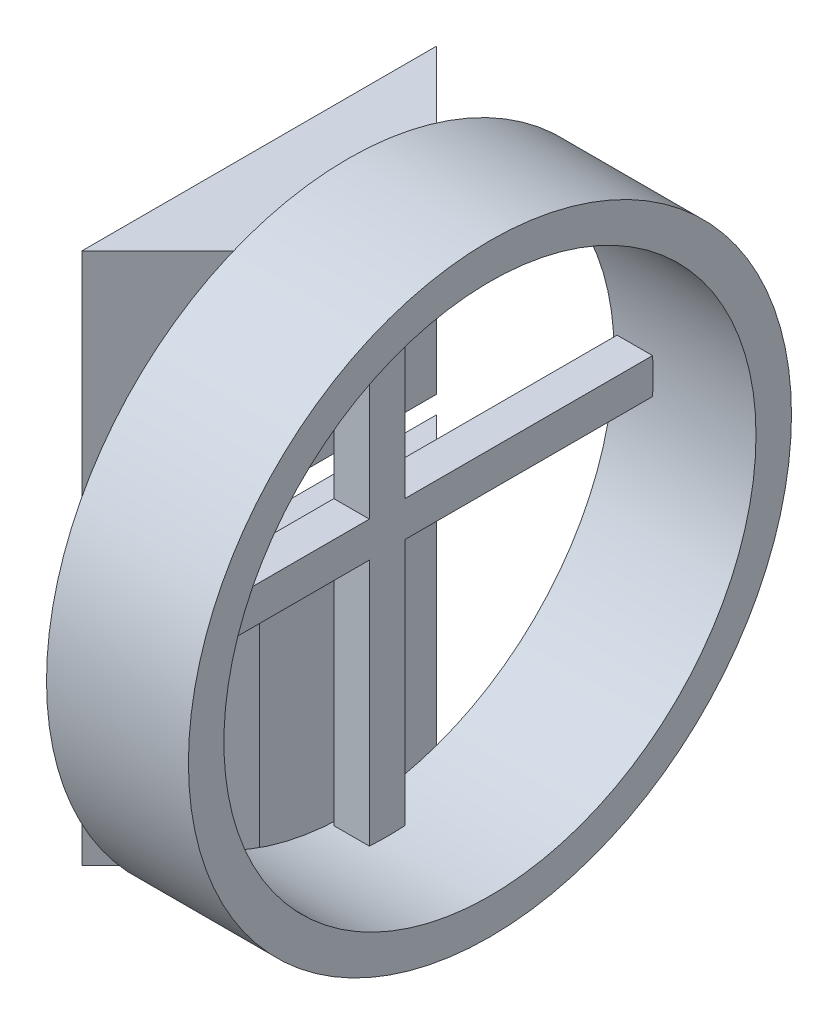
ISO-10303-21;
HEADER;
FILE_DESCRIPTION(('STEP AP214'),'2;1');
FILE_NAME('part.step','',(''),(''),'','','');
FILE_SCHEMA(('AUTOMOTIVE_DESIGN { 1 0 10303 214 1 1 1 1 }'));
ENDSEC;
DATA;
#1=APPLICATION_CONTEXT('core data for automotive mechanical design processes');
#2=APPLICATION_PROTOCOL_DEFINITION('international standard','automotive_design',2000,#1);
#3=PRODUCT_CONTEXT('',#1,'mechanical');
#4=PRODUCT('Part','Part','',(#3));
#5=PRODUCT_RELATED_PRODUCT_CATEGORY('part','',(#4));
#6=PRODUCT_DEFINITION_FORMATION('','',#4);
#7=PRODUCT_DEFINITION_CONTEXT('part definition',#1,'design');
#8=PRODUCT_DEFINITION('design','',#6,#7);
#9=PRODUCT_DEFINITION_SHAPE('','',#8);
#10=(LENGTH_UNIT() NAMED_UNIT(*) SI_UNIT(.MILLI.,.METRE.));
#11=(NAMED_UNIT(*) PLANE_ANGLE_UNIT() SI_UNIT($,.RADIAN.));
#12=(NAMED_UNIT(*) SI_UNIT($,.STERADIAN.) SOLID_ANGLE_UNIT());
#13=UNCERTAINTY_MEASURE_WITH_UNIT(LENGTH_MEASURE(1.E-05),#10,'distance_accuracy_value','');
#14=(GEOMETRIC_REPRESENTATION_CONTEXT(3) GLOBAL_UNCERTAINTY_ASSIGNED_CONTEXT((#13)) GLOBAL_UNIT_ASSIGNED_CONTEXT((#10,
#11,#12)) REPRESENTATION_CONTEXT('',''));
#15=CARTESIAN_POINT('',(0.,0.,0.));
#16=DIRECTION('',(0.,0.,1.));
#17=DIRECTION('',(1.,0.,0.));
#18=AXIS2_PLACEMENT_3D('',#15,#16,#17);
#19=CARTESIAN_POINT('',(10.,15.,0.));
#20=DIRECTION('',(1.,0.,0.));
#21=DIRECTION('',(0.,0.,-1.));
#22=AXIS2_PLACEMENT_3D('',#19,#20,#21);
#23=PLANE('',#22);
#24=DIRECTION('',(0.,-1.,0.));
#25=VECTOR('',#24,1.);
#26=CARTESIAN_POINT('',(10.,15.,5.));
#27=LINE('',#26,#25);
#28=CARTESIAN_POINT('',(10.,6.,5.));
#29=VERTEX_POINT('',#28);
#30=CARTESIAN_POINT('',(10.,0.,5.));
#31=VERTEX_POINT('',#30);
#32=EDGE_CURVE('E111',#29,#31,#27,.T.);
#33=ORIENTED_EDGE('',*,*,#32,.F.);
#34=DIRECTION('',(0.,0.,-1.));
#35=VECTOR('',#34,1.);
#36=CARTESIAN_POINT('',(10.,6.,0.));
#37=LINE('',#36,#35);
#38=CARTESIAN_POINT('',(10.,6.,-5.00000000000002));
#39=VERTEX_POINT('',#38);
#40=EDGE_CURVE('E74',#29,#39,#37,.T.);
#41=ORIENTED_EDGE('',*,*,#40,.T.);
#42=DIRECTION('',(0.,-1.,0.));
#43=VECTOR('',#42,1.);
#44=CARTESIAN_POINT('',(10.,15.,-5.00000000000002));
#45=LINE('',#44,#43);
#46=CARTESIAN_POINT('',(10.,0.,-5.00000000000002));
#47=VERTEX_POINT('',#46);
#48=EDGE_CURVE('E55',#39,#47,#45,.T.);
#49=ORIENTED_EDGE('',*,*,#48,.T.);
#50=DIRECTION('',(0.,0.,1.));
#51=VECTOR('',#50,1.);
#52=CARTESIAN_POINT('',(10.,0.,0.));
#53=LINE('',#52,#51);
#54=EDGE_CURVE('E115',#47,#31,#53,.T.);
#55=ORIENTED_EDGE('',*,*,#54,.T.);
#56=EDGE_LOOP('',(#33,#41,#49,#55));
#57=FACE_BOUND('',#56,.T.);
#58=ADVANCED_FACE('F52',(#57),#23,.F.);
#59=CARTESIAN_POINT('',(7.50000000000001,15.,7.5));
#60=DIRECTION('',(-0.707106781186548,0.,-0.707106781186547));
#61=DIRECTION('',(-0.707106781186547,0.,0.707106781186548));
#62=AXIS2_PLACEMENT_3D('',#59,#60,#61);
#63=PLANE('',#62);
#64=DIRECTION('',(0.,-1.,0.));
#65=VECTOR('',#64,1.);
#66=CARTESIAN_POINT('',(12.5,15.,2.5));
#67=LINE('',#66,#65);
#68=CARTESIAN_POINT('',(12.5,6.,2.5));
#69=VERTEX_POINT('',#68);
#70=CARTESIAN_POINT('',(12.5,0.,2.5));
#71=VERTEX_POINT('',#70);
#72=EDGE_CURVE('E96',#69,#71,#67,.T.);
#73=ORIENTED_EDGE('',*,*,#72,.F.);
#74=DIRECTION('',(-0.707106781186547,0.,0.707106781186548));
#75=VECTOR('',#74,1.);
#76=CARTESIAN_POINT('',(7.50000000000001,6.,7.5));
#77=LINE('',#76,#75);
#78=EDGE_CURVE('E68',#69,#29,#77,.T.);
#79=ORIENTED_EDGE('',*,*,#78,.T.);
#80=ORIENTED_EDGE('',*,*,#32,.T.);
#81=DIRECTION('',(0.707106781186547,0.,-0.707106781186548));
#82=VECTOR('',#81,1.);
#83=CARTESIAN_POINT('',(7.50000000000001,0.,7.5));
#84=LINE('',#83,#82);
#85=EDGE_CURVE('E97',#31,#71,#84,.T.);
#86=ORIENTED_EDGE('',*,*,#85,.T.);
#87=EDGE_LOOP('',(#73,#79,#80,#86));
#88=FACE_BOUND('',#87,.T.);
#89=ADVANCED_FACE('F121',(#88),#63,.F.);
#90=CARTESIAN_POINT('',(12.5,15.,0.));
#91=DIRECTION('',(1.,0.,0.));
#92=DIRECTION('',(0.,0.,-1.));
#93=AXIS2_PLACEMENT_3D('',#90,#91,#92);
#94=PLANE('',#93);
#95=DIRECTION('',(0.,0.,1.));
#96=VECTOR('',#95,1.);
#97=CARTESIAN_POINT('',(12.5,6.,-8.5));
#98=LINE('',#97,#96);
#99=CARTESIAN_POINT('',(12.5,6.,-2.5));
#100=VERTEX_POINT('',#99);
#101=EDGE_CURVE('E89',#100,#69,#98,.T.);
#102=ORIENTED_EDGE('',*,*,#101,.T.);
#103=ORIENTED_EDGE('',*,*,#72,.T.);
#104=DIRECTION('',(0.,0.,1.));
#105=VECTOR('',#104,1.);
#106=CARTESIAN_POINT('',(12.5,0.,0.));
#107=LINE('',#106,#105);
#108=CARTESIAN_POINT('',(12.5,0.,-2.5));
#109=VERTEX_POINT('',#108);
#110=EDGE_CURVE('E13',#109,#71,#107,.T.);
#111=ORIENTED_EDGE('',*,*,#110,.F.);
#112=DIRECTION('',(0.,-1.,0.));
#113=VECTOR('',#112,1.);
#114=CARTESIAN_POINT('',(12.5,15.,-2.5));
#115=LINE('',#114,#113);
#116=EDGE_CURVE('E103',#100,#109,#115,.T.);
#117=ORIENTED_EDGE('',*,*,#116,.F.);
#118=EDGE_LOOP('',(#102,#103,#111,#117));
#119=FACE_BOUND('',#118,.T.);
#120=ADVANCED_FACE('F107',(#119),#94,.T.);
#121=CARTESIAN_POINT('',(7.50000000000007,15.,-7.49999999999999));
#122=DIRECTION('',(-0.707106781186551,0.,0.707106781186544));
#123=DIRECTION('',(0.707106781186544,0.,0.707106781186551));
#124=AXIS2_PLACEMENT_3D('',#121,#122,#123);
#125=PLANE('',#124);
#126=ORIENTED_EDGE('',*,*,#48,.F.);
#127=DIRECTION('',(0.707106781186544,0.,0.707106781186551));
#128=VECTOR('',#127,1.);
#129=CARTESIAN_POINT('',(7.50000000000007,6.,-7.49999999999999));
#130=LINE('',#129,#128);
#131=EDGE_CURVE('E92',#39,#100,#130,.T.);
#132=ORIENTED_EDGE('',*,*,#131,.T.);
#133=ORIENTED_EDGE('',*,*,#116,.T.);
#134=DIRECTION('',(-0.707106781186544,0.,-0.707106781186551));
#135=VECTOR('',#134,1.);
#136=CARTESIAN_POINT('',(7.50000000000007,0.,-7.49999999999999));
#137=LINE('',#136,#135);
#138=EDGE_CURVE('E60',#109,#47,#137,.T.);
#139=ORIENTED_EDGE('',*,*,#138,.T.);
#140=EDGE_LOOP('',(#126,#132,#133,#139));
#141=FACE_BOUND('',#140,.T.);
#142=ADVANCED_FACE('F101',(#141),#125,.F.);
#143=CARTESIAN_POINT('',(0.,0.,0.));
#144=DIRECTION('',(0.,1.,0.));
#145=DIRECTION('',(0.,0.,1.));
#146=AXIS2_PLACEMENT_3D('',#143,#144,#145);
#147=PLANE('',#146);
#148=ORIENTED_EDGE('',*,*,#54,.F.);
#149=ORIENTED_EDGE('',*,*,#138,.F.);
#150=ORIENTED_EDGE('',*,*,#110,.T.);
#151=ORIENTED_EDGE('',*,*,#85,.F.);
#152=EDGE_LOOP('',(#148,#149,#150,#151));
#153=FACE_BOUND('',#152,.T.);
#154=ADVANCED_FACE('F125',(#153),#147,.F.);
#155=CARTESIAN_POINT('',(7.50000000000002,6.,-8.5));
#156=DIRECTION('',(0.,-1.,0.));
#157=DIRECTION('',(0.,0.,-1.));
#158=AXIS2_PLACEMENT_3D('',#155,#156,#157);
#159=PLANE('',#158);
#160=ORIENTED_EDGE('',*,*,#101,.F.);
#161=ORIENTED_EDGE('',*,*,#131,.F.);
#162=ORIENTED_EDGE('',*,*,#40,.F.);
#163=ORIENTED_EDGE('',*,*,#78,.F.);
#164=EDGE_LOOP('',(#160,#161,#162,#163));
#165=FACE_BOUND('',#164,.T.);
#166=ADVANCED_FACE('F91',(#165),#159,.F.);
#167=CLOSED_SHELL('',(#58,#89,#120,#142,#154,#166));
#168=MANIFOLD_SOLID_BREP('B2',#167);
#169=CARTESIAN_POINT('',(13.6,7.,0.));
#170=DIRECTION('',(0.,-1.,0.));
#171=DIRECTION('',(0.,0.,-1.));
#172=AXIS2_PLACEMENT_3D('',#169,#170,#171);
#173=PLANE('',#172);
#174=DIRECTION('',(0.,0.,-1.));
#175=VECTOR('',#174,1.);
#176=CARTESIAN_POINT('',(12.6,7.,0.));
#177=LINE('',#176,#175);
#178=CARTESIAN_POINT('',(12.6,7.,0.499999999999986));
#179=VERTEX_POINT('',#178);
#180=CARTESIAN_POINT('',(12.6,7.,7.48331477354788));
#181=VERTEX_POINT('',#180);
#182=EDGE_CURVE('E313',#179,#181,#177,.F.);
#183=ORIENTED_EDGE('',*,*,#182,.F.);
#184=DIRECTION('',(1.,0.,0.));
#185=VECTOR('',#184,1.);
#186=CARTESIAN_POINT('',(13.6,7.,0.499999999999995));
#187=LINE('',#186,#185);
#188=CARTESIAN_POINT('',(13.6,7.,0.499999999999999));
#189=VERTEX_POINT('',#188);
#190=EDGE_CURVE('E353',#179,#189,#187,.T.);
#191=ORIENTED_EDGE('',*,*,#190,.T.);
#192=DIRECTION('',(0.,0.,-1.));
#193=VECTOR('',#192,1.);
#194=CARTESIAN_POINT('',(13.6,7.,0.));
#195=LINE('',#194,#193);
#196=CARTESIAN_POINT('',(13.6,7.,7.48331477354788));
#197=VERTEX_POINT('',#196);
#198=EDGE_CURVE('E301',#189,#197,#195,.F.);
#199=ORIENTED_EDGE('',*,*,#198,.T.);
#200=DIRECTION('',(-1.,0.,0.));
#201=VECTOR('',#200,1.);
#202=CARTESIAN_POINT('',(16.5,7.,7.48331477354788));
#203=LINE('',#202,#201);
#204=EDGE_CURVE('E189',#197,#181,#203,.T.);
#205=ORIENTED_EDGE('',*,*,#204,.T.);
#206=EDGE_LOOP('',(#183,#191,#199,#205));
#207=FACE_BOUND('',#206,.T.);
#208=ADVANCED_FACE('F185',(#207),#173,.T.);
#209=CARTESIAN_POINT('',(13.6,8.,0.));
#210=DIRECTION('',(0.,-1.,0.));
#211=DIRECTION('',(0.,0.,-1.));
#212=AXIS2_PLACEMENT_3D('',#209,#210,#211);
#213=PLANE('',#212);
#214=DIRECTION('',(1.,0.,0.));
#215=VECTOR('',#214,1.);
#216=CARTESIAN_POINT('',(13.6,8.,0.500000000000006));
#217=LINE('',#216,#215);
#218=CARTESIAN_POINT('',(12.6,8.,0.500000000000002));
#219=VERTEX_POINT('',#218);
#220=CARTESIAN_POINT('',(13.6,8.,0.500000000000015));
#221=VERTEX_POINT('',#220);
#222=EDGE_CURVE('E359',#219,#221,#217,.T.);
#223=ORIENTED_EDGE('',*,*,#222,.F.);
#224=DIRECTION('',(0.,0.,-1.));
#225=VECTOR('',#224,1.);
#226=CARTESIAN_POINT('',(12.6,8.,0.));
#227=LINE('',#226,#225);
#228=CARTESIAN_POINT('',(12.6,8.,7.48331477354788));
#229=VERTEX_POINT('',#228);
#230=EDGE_CURVE('E312',#219,#229,#227,.F.);
#231=ORIENTED_EDGE('',*,*,#230,.T.);
#232=DIRECTION('',(-1.,0.,0.));
#233=VECTOR('',#232,1.);
#234=CARTESIAN_POINT('',(16.5,8.,7.48331477354788));
#235=LINE('',#234,#233);
#236=CARTESIAN_POINT('',(13.6,8.,7.48331477354788));
#237=VERTEX_POINT('',#236);
#238=EDGE_CURVE('E332',#237,#229,#235,.T.);
#239=ORIENTED_EDGE('',*,*,#238,.F.);
#240=DIRECTION('',(0.,0.,-1.));
#241=VECTOR('',#240,1.);
#242=CARTESIAN_POINT('',(13.6,8.,0.));
#243=LINE('',#242,#241);
#244=EDGE_CURVE('E316',#221,#237,#243,.F.);
#245=ORIENTED_EDGE('',*,*,#244,.F.);
#246=EDGE_LOOP('',(#223,#231,#239,#245));
#247=FACE_BOUND('',#246,.T.);
#248=ADVANCED_FACE('F358',(#247),#213,.F.);
#249=CARTESIAN_POINT('',(16.5,7.5,0.));
#250=DIRECTION('',(1.,0.,0.));
#251=DIRECTION('',(0.,0.,-1.));
#252=AXIS2_PLACEMENT_3D('',#249,#250,#251);
#253=PLANE('',#252);
#254=CARTESIAN_POINT('',(16.5,7.5,0.));
#255=DIRECTION('',(1.,0.,0.));
#256=DIRECTION('',(0.,0.,-1.));
#257=AXIS2_PLACEMENT_3D('',#254,#255,#256);
#258=CIRCLE('',#257,8.5);
#259=CARTESIAN_POINT('',(16.5,7.5,-8.5));
#260=VERTEX_POINT('',#259);
#261=EDGE_CURVE('E320',#260,#260,#258,.T.);
#262=ORIENTED_EDGE('',*,*,#261,.T.);
#263=EDGE_LOOP('',(#262));
#264=FACE_BOUND('',#263,.T.);
#265=CARTESIAN_POINT('',(16.5,7.5,0.));
#266=DIRECTION('',(1.,0.,0.));
#267=DIRECTION('',(0.,0.,-1.));
#268=AXIS2_PLACEMENT_3D('',#265,#266,#267);
#269=CIRCLE('',#268,7.5);
#270=CARTESIAN_POINT('',(16.5,7.5,-7.5));
#271=VERTEX_POINT('',#270);
#272=EDGE_CURVE('E304',#271,#271,#269,.T.);
#273=ORIENTED_EDGE('',*,*,#272,.F.);
#274=EDGE_LOOP('',(#273));
#275=FACE_BOUND('',#274,.T.);
#276=ADVANCED_FACE('F416',(#264,#275),#253,.T.);
#277=CARTESIAN_POINT('',(12.5,7.5,0.));
#278=DIRECTION('',(1.,0.,0.));
#279=DIRECTION('',(0.,0.,-1.));
#280=AXIS2_PLACEMENT_3D('',#277,#278,#279);
#281=PLANE('',#280);
#282=CARTESIAN_POINT('',(12.5,7.5,0.));
#283=DIRECTION('',(1.,0.,0.));
#284=DIRECTION('',(0.,0.,-1.));
#285=AXIS2_PLACEMENT_3D('',#282,#283,#284);
#286=CIRCLE('',#285,7.5);
#287=CARTESIAN_POINT('',(12.5,7.5,-7.5));
#288=VERTEX_POINT('',#287);
#289=EDGE_CURVE('E300',#288,#288,#286,.T.);
#290=ORIENTED_EDGE('',*,*,#289,.T.);
#291=EDGE_LOOP('',(#290));
#292=FACE_BOUND('',#291,.T.);
#293=CARTESIAN_POINT('',(12.5,7.5,0.));
#294=DIRECTION('',(1.,0.,0.));
#295=DIRECTION('',(0.,0.,-1.));
#296=AXIS2_PLACEMENT_3D('',#293,#294,#295);
#297=CIRCLE('',#296,8.5);
#298=CARTESIAN_POINT('',(12.5,7.5,-8.5));
#299=VERTEX_POINT('',#298);
#300=EDGE_CURVE('E318',#299,#299,#297,.T.);
#301=ORIENTED_EDGE('',*,*,#300,.F.);
#302=EDGE_LOOP('',(#301));
#303=FACE_BOUND('',#302,.T.);
#304=ADVANCED_FACE('F408',(#292,#303),#281,.F.);
#305=CARTESIAN_POINT('',(16.5,7.5,0.));
#306=DIRECTION('',(-1.,0.,0.));
#307=DIRECTION('',(0.,0.,1.));
#308=AXIS2_PLACEMENT_3D('',#305,#306,#307);
#309=CYLINDRICAL_SURFACE('',#308,8.5);
#310=ORIENTED_EDGE('',*,*,#261,.F.);
#311=EDGE_LOOP('',(#310));
#312=FACE_BOUND('',#311,.T.);
#313=ORIENTED_EDGE('',*,*,#300,.T.);
#314=EDGE_LOOP('',(#313));
#315=FACE_BOUND('',#314,.T.);
#316=ADVANCED_FACE('F187',(#312,#315),#309,.T.);
#317=CARTESIAN_POINT('',(16.5,7.5,0.));
#318=DIRECTION('',(-1.,0.,0.));
#319=DIRECTION('',(0.,0.,1.));
#320=AXIS2_PLACEMENT_3D('',#317,#318,#319);
#321=CYLINDRICAL_SURFACE('',#320,7.5);
#322=CARTESIAN_POINT('',(13.6,7.5,0.));
#323=DIRECTION('',(1.,0.,0.));
#324=DIRECTION('',(0.,0.,-1.));
#325=AXIS2_PLACEMENT_3D('',#322,#323,#324);
#326=CIRCLE('',#325,7.5);
#327=CARTESIAN_POINT('',(13.6,14.9833147735479,-0.499999999999974));
#328=VERTEX_POINT('',#327);
#329=CARTESIAN_POINT('',(13.6,14.9833147735479,0.500000000000027));
#330=VERTEX_POINT('',#329);
#331=EDGE_CURVE('E375',#328,#330,#326,.T.);
#332=ORIENTED_EDGE('',*,*,#331,.F.);
#333=DIRECTION('',(-1.,0.,0.));
#334=VECTOR('',#333,1.);
#335=CARTESIAN_POINT('',(16.5,14.9833147735479,-0.499999999999974));
#336=LINE('',#335,#334);
#337=CARTESIAN_POINT('',(12.6,14.9833147735479,-0.499999999999974));
#338=VERTEX_POINT('',#337);
#339=EDGE_CURVE('E378',#338,#328,#336,.F.);
#340=ORIENTED_EDGE('',*,*,#339,.F.);
#341=CARTESIAN_POINT('',(12.6,7.5,0.));
#342=DIRECTION('',(1.,0.,0.));
#343=DIRECTION('',(0.,0.,-1.));
#344=AXIS2_PLACEMENT_3D('',#341,#342,#343);
#345=CIRCLE('',#344,7.5);
#346=CARTESIAN_POINT('',(12.6,14.9833147735479,0.500000000000027));
#347=VERTEX_POINT('',#346);
#348=EDGE_CURVE('E372',#338,#347,#345,.T.);
#349=ORIENTED_EDGE('',*,*,#348,.T.);
#350=DIRECTION('',(-1.,0.,0.));
#351=VECTOR('',#350,1.);
#352=CARTESIAN_POINT('',(16.5,14.9833147735479,0.500000000000027));
#353=LINE('',#352,#351);
#354=EDGE_CURVE('E364',#347,#330,#353,.F.);
#355=ORIENTED_EDGE('',*,*,#354,.T.);
#356=EDGE_LOOP('',(#332,#340,#349,#355));
#357=FACE_BOUND('',#356,.T.);
#358=CARTESIAN_POINT('',(13.6,0.0166852264521155,0.499999999999974));
#359=VERTEX_POINT('',#358);
#360=CARTESIAN_POINT('',(13.6,0.016685226452119,-0.500000000000027));
#361=VERTEX_POINT('',#360);
#362=EDGE_CURVE('E293',#359,#361,#326,.T.);
#363=ORIENTED_EDGE('',*,*,#362,.F.);
#364=DIRECTION('',(-1.,0.,0.));
#365=VECTOR('',#364,1.);
#366=CARTESIAN_POINT('',(16.5,0.0166852264521155,0.499999999999974));
#367=LINE('',#366,#365);
#368=CARTESIAN_POINT('',(12.6,0.0166852264521155,0.499999999999974));
#369=VERTEX_POINT('',#368);
#370=EDGE_CURVE('E380',#359,#369,#367,.T.);
#371=ORIENTED_EDGE('',*,*,#370,.T.);
#372=CARTESIAN_POINT('',(12.6,0.016685226452119,-0.500000000000027));
#373=VERTEX_POINT('',#372);
#374=EDGE_CURVE('E374',#369,#373,#345,.T.);
#375=ORIENTED_EDGE('',*,*,#374,.T.);
#376=DIRECTION('',(-1.,0.,0.));
#377=VECTOR('',#376,1.);
#378=CARTESIAN_POINT('',(16.5,0.016685226452119,-0.500000000000027));
#379=LINE('',#378,#377);
#380=EDGE_CURVE('E351',#361,#373,#379,.T.);
#381=ORIENTED_EDGE('',*,*,#380,.F.);
#382=EDGE_LOOP('',(#363,#371,#375,#381));
#383=FACE_BOUND('',#382,.T.);
#384=CARTESIAN_POINT('',(13.6,7.5,0.));
#385=DIRECTION('',(1.,0.,0.));
#386=DIRECTION('',(0.,0.,-1.));
#387=AXIS2_PLACEMENT_3D('',#384,#385,#386);
#388=CIRCLE('',#387,7.5);
#389=EDGE_CURVE('E50',#237,#197,#388,.T.);
#390=ORIENTED_EDGE('',*,*,#389,.F.);
#391=ORIENTED_EDGE('',*,*,#238,.T.);
#392=CARTESIAN_POINT('',(12.6,7.5,0.));
#393=DIRECTION('',(1.,0.,0.));
#394=DIRECTION('',(0.,0.,-1.));
#395=AXIS2_PLACEMENT_3D('',#392,#393,#394);
#396=CIRCLE('',#395,7.5);
#397=EDGE_CURVE('E329',#229,#181,#396,.T.);
#398=ORIENTED_EDGE('',*,*,#397,.T.);
#399=ORIENTED_EDGE('',*,*,#204,.F.);
#400=EDGE_LOOP('',(#390,#391,#398,#399));
#401=FACE_BOUND('',#400,.T.);
#402=CARTESIAN_POINT('',(13.6,7.,-7.48331477354788));
#403=VERTEX_POINT('',#402);
#404=CARTESIAN_POINT('',(13.6,8.,-7.48331477354788));
#405=VERTEX_POINT('',#404);
#406=EDGE_CURVE('E195',#403,#405,#388,.T.);
#407=ORIENTED_EDGE('',*,*,#406,.F.);
#408=DIRECTION('',(-1.,0.,0.));
#409=VECTOR('',#408,1.);
#410=CARTESIAN_POINT('',(16.5,7.,-7.48331477354788));
#411=LINE('',#410,#409);
#412=CARTESIAN_POINT('',(12.6,7.,-7.48331477354788));
#413=VERTEX_POINT('',#412);
#414=EDGE_CURVE('E299',#413,#403,#411,.F.);
#415=ORIENTED_EDGE('',*,*,#414,.F.);
#416=CARTESIAN_POINT('',(12.6,8.,-7.48331477354788));
#417=VERTEX_POINT('',#416);
#418=EDGE_CURVE('E323',#413,#417,#396,.T.);
#419=ORIENTED_EDGE('',*,*,#418,.T.);
#420=DIRECTION('',(-1.,0.,0.));
#421=VECTOR('',#420,1.);
#422=CARTESIAN_POINT('',(16.5,8.,-7.48331477354788));
#423=LINE('',#422,#421);
#424=EDGE_CURVE('E328',#417,#405,#423,.F.);
#425=ORIENTED_EDGE('',*,*,#424,.T.);
#426=EDGE_LOOP('',(#407,#415,#419,#425));
#427=FACE_BOUND('',#426,.T.);
#428=ORIENTED_EDGE('',*,*,#272,.T.);
#429=EDGE_LOOP('',(#428));
#430=FACE_BOUND('',#429,.T.);
#431=ORIENTED_EDGE('',*,*,#289,.F.);
#432=EDGE_LOOP('',(#431));
#433=FACE_BOUND('',#432,.T.);
#434=ADVANCED_FACE('F341',(#357,#383,#401,#427,#430,#433),#321,.F.);
#435=CARTESIAN_POINT('',(13.6,0.,0.));
#436=DIRECTION('',(1.,0.,0.));
#437=DIRECTION('',(0.,0.,-1.));
#438=AXIS2_PLACEMENT_3D('',#435,#436,#437);
#439=PLANE('',#438);
#440=CARTESIAN_POINT('',(13.6,8.,-0.499999999999986));
#441=VERTEX_POINT('',#440);
#442=EDGE_CURVE('E306',#405,#441,#243,.F.);
#443=ORIENTED_EDGE('',*,*,#442,.T.);
#444=DIRECTION('',(0.,1.,0.));
#445=VECTOR('',#444,1.);
#446=CARTESIAN_POINT('',(13.6,7.5,-0.5));
#447=LINE('',#446,#445);
#448=EDGE_CURVE('E294',#328,#441,#447,.F.);
#449=ORIENTED_EDGE('',*,*,#448,.F.);
#450=ORIENTED_EDGE('',*,*,#331,.T.);
#451=DIRECTION('',(0.,1.,0.));
#452=VECTOR('',#451,1.);
#453=CARTESIAN_POINT('',(13.6,7.5,0.5));
#454=LINE('',#453,#452);
#455=EDGE_CURVE('E295',#330,#221,#454,.F.);
#456=ORIENTED_EDGE('',*,*,#455,.T.);
#457=ORIENTED_EDGE('',*,*,#244,.T.);
#458=ORIENTED_EDGE('',*,*,#389,.T.);
#459=ORIENTED_EDGE('',*,*,#198,.F.);
#460=EDGE_CURVE('E366',#189,#359,#454,.F.);
#461=ORIENTED_EDGE('',*,*,#460,.T.);
#462=ORIENTED_EDGE('',*,*,#362,.T.);
#463=CARTESIAN_POINT('',(13.6,7.,-0.5));
#464=VERTEX_POINT('',#463);
#465=EDGE_CURVE('E278',#464,#361,#447,.F.);
#466=ORIENTED_EDGE('',*,*,#465,.F.);
#467=EDGE_CURVE('E289',#403,#464,#195,.F.);
#468=ORIENTED_EDGE('',*,*,#467,.F.);
#469=ORIENTED_EDGE('',*,*,#406,.T.);
#470=EDGE_LOOP('',(#443,#449,#450,#456,#457,#458,#459,#461,#462,#466,#468,#469));
#471=FACE_BOUND('',#470,.T.);
#472=ADVANCED_FACE('F288',(#471),#439,.T.);
#473=CARTESIAN_POINT('',(12.6,0.,0.));
#474=DIRECTION('',(1.,0.,0.));
#475=DIRECTION('',(0.,0.,-1.));
#476=AXIS2_PLACEMENT_3D('',#473,#474,#475);
#477=PLANE('',#476);
#478=ORIENTED_EDGE('',*,*,#397,.F.);
#479=ORIENTED_EDGE('',*,*,#230,.F.);
#480=DIRECTION('',(0.,1.,0.));
#481=VECTOR('',#480,1.);
#482=CARTESIAN_POINT('',(12.6,7.5,0.5));
#483=LINE('',#482,#481);
#484=EDGE_CURVE('E202',#347,#219,#483,.F.);
#485=ORIENTED_EDGE('',*,*,#484,.F.);
#486=ORIENTED_EDGE('',*,*,#348,.F.);
#487=DIRECTION('',(0.,1.,0.));
#488=VECTOR('',#487,1.);
#489=CARTESIAN_POINT('',(12.6,7.5,-0.5));
#490=LINE('',#489,#488);
#491=CARTESIAN_POINT('',(12.6,8.,-0.499999999999986));
#492=VERTEX_POINT('',#491);
#493=EDGE_CURVE('E369',#338,#492,#490,.F.);
#494=ORIENTED_EDGE('',*,*,#493,.T.);
#495=EDGE_CURVE('E314',#417,#492,#227,.F.);
#496=ORIENTED_EDGE('',*,*,#495,.F.);
#497=ORIENTED_EDGE('',*,*,#418,.F.);
#498=CARTESIAN_POINT('',(12.6,7.,-0.500000000000002));
#499=VERTEX_POINT('',#498);
#500=EDGE_CURVE('E310',#413,#499,#177,.F.);
#501=ORIENTED_EDGE('',*,*,#500,.T.);
#502=EDGE_CURVE('E209',#499,#373,#490,.F.);
#503=ORIENTED_EDGE('',*,*,#502,.T.);
#504=ORIENTED_EDGE('',*,*,#374,.F.);
#505=EDGE_CURVE('E348',#179,#369,#483,.F.);
#506=ORIENTED_EDGE('',*,*,#505,.F.);
#507=ORIENTED_EDGE('',*,*,#182,.T.);
#508=EDGE_LOOP('',(#478,#479,#485,#486,#494,#496,#497,#501,#503,#504,#506,#507));
#509=FACE_BOUND('',#508,.T.);
#510=ADVANCED_FACE('F343',(#509),#477,.F.);
#511=DIRECTION('',(1.,0.,0.));
#512=VECTOR('',#511,1.);
#513=CARTESIAN_POINT('',(13.6,7.,-0.500000000000006));
#514=LINE('',#513,#512);
#515=EDGE_CURVE('E275',#499,#464,#514,.T.);
#516=ORIENTED_EDGE('',*,*,#515,.F.);
#517=ORIENTED_EDGE('',*,*,#500,.F.);
#518=ORIENTED_EDGE('',*,*,#414,.T.);
#519=ORIENTED_EDGE('',*,*,#467,.T.);
#520=EDGE_LOOP('',(#516,#517,#518,#519));
#521=FACE_BOUND('',#520,.T.);
#522=ADVANCED_FACE('F297',(#521),#173,.T.);
#523=ORIENTED_EDGE('',*,*,#495,.T.);
#524=DIRECTION('',(1.,0.,0.));
#525=VECTOR('',#524,1.);
#526=CARTESIAN_POINT('',(13.6,8.,-0.499999999999995));
#527=LINE('',#526,#525);
#528=EDGE_CURVE('E283',#492,#441,#527,.T.);
#529=ORIENTED_EDGE('',*,*,#528,.T.);
#530=ORIENTED_EDGE('',*,*,#442,.F.);
#531=ORIENTED_EDGE('',*,*,#424,.F.);
#532=EDGE_LOOP('',(#523,#529,#530,#531));
#533=FACE_BOUND('',#532,.T.);
#534=ADVANCED_FACE('F392',(#533),#213,.F.);
#535=CARTESIAN_POINT('',(13.6,7.5,0.5));
#536=DIRECTION('',(0.,0.,-1.));
#537=DIRECTION('',(0.,1.,0.));
#538=AXIS2_PLACEMENT_3D('',#535,#536,#537);
#539=PLANE('',#538);
#540=ORIENTED_EDGE('',*,*,#354,.F.);
#541=ORIENTED_EDGE('',*,*,#484,.T.);
#542=ORIENTED_EDGE('',*,*,#222,.T.);
#543=ORIENTED_EDGE('',*,*,#455,.F.);
#544=EDGE_LOOP('',(#540,#541,#542,#543));
#545=FACE_BOUND('',#544,.T.);
#546=ADVANCED_FACE('F362',(#545),#539,.F.);
#547=CARTESIAN_POINT('',(13.6,7.5,-0.5));
#548=DIRECTION('',(0.,0.,-1.));
#549=DIRECTION('',(0.,1.,0.));
#550=AXIS2_PLACEMENT_3D('',#547,#548,#549);
#551=PLANE('',#550);
#552=ORIENTED_EDGE('',*,*,#493,.F.);
#553=ORIENTED_EDGE('',*,*,#339,.T.);
#554=ORIENTED_EDGE('',*,*,#448,.T.);
#555=ORIENTED_EDGE('',*,*,#528,.F.);
#556=EDGE_LOOP('',(#552,#553,#554,#555));
#557=FACE_BOUND('',#556,.T.);
#558=ADVANCED_FACE('F399',(#557),#551,.T.);
#559=ORIENTED_EDGE('',*,*,#465,.T.);
#560=ORIENTED_EDGE('',*,*,#380,.T.);
#561=ORIENTED_EDGE('',*,*,#502,.F.);
#562=ORIENTED_EDGE('',*,*,#515,.T.);
#563=EDGE_LOOP('',(#559,#560,#561,#562));
#564=FACE_BOUND('',#563,.T.);
#565=ADVANCED_FACE('F277',(#564),#551,.T.);
#566=ORIENTED_EDGE('',*,*,#370,.F.);
#567=ORIENTED_EDGE('',*,*,#460,.F.);
#568=ORIENTED_EDGE('',*,*,#190,.F.);
#569=ORIENTED_EDGE('',*,*,#505,.T.);
#570=EDGE_LOOP('',(#566,#567,#568,#569));
#571=FACE_BOUND('',#570,.T.);
#572=ADVANCED_FACE('F430',(#571),#539,.F.);
#573=CLOSED_SHELL('',(#208,#248,#276,#304,#316,#434,#472,#510,#522,#534,#546,#558,#565,#572));
#574=MANIFOLD_SOLID_BREP('B7',#573);
#575=CARTESIAN_POINT('',(0.,15.,0.));
#576=DIRECTION('',(0.,1.,0.));
#577=DIRECTION('',(0.,0.,1.));
#578=AXIS2_PLACEMENT_3D('',#575,#576,#577);
#579=PLANE('',#578);
#580=DIRECTION('',(0.,0.,1.));
#581=VECTOR('',#580,1.);
#582=CARTESIAN_POINT('',(10.,15.,0.));
#583=LINE('',#582,#581);
#584=CARTESIAN_POINT('',(10.,15.,-5.00000000000002));
#585=VERTEX_POINT('',#584);
#586=CARTESIAN_POINT('',(10.,15.,5.));
#587=VERTEX_POINT('',#586);
#588=EDGE_CURVE('E629',#585,#587,#583,.T.);
#589=ORIENTED_EDGE('',*,*,#588,.T.);
#590=DIRECTION('',(0.707106781186547,0.,-0.707106781186548));
#591=VECTOR('',#590,1.);
#592=CARTESIAN_POINT('',(7.50000000000001,15.,7.5));
#593=LINE('',#592,#591);
#594=CARTESIAN_POINT('',(12.5,15.,2.5));
#595=VERTEX_POINT('',#594);
#596=EDGE_CURVE('E626',#587,#595,#593,.T.);
#597=ORIENTED_EDGE('',*,*,#596,.T.);
#598=DIRECTION('',(0.,0.,1.));
#599=VECTOR('',#598,1.);
#600=CARTESIAN_POINT('',(12.5,15.,0.));
#601=LINE('',#600,#599);
#602=CARTESIAN_POINT('',(12.5,15.,-2.5));
#603=VERTEX_POINT('',#602);
#604=EDGE_CURVE('E635',#603,#595,#601,.T.);
#605=ORIENTED_EDGE('',*,*,#604,.F.);
#606=DIRECTION('',(-0.707106781186544,0.,-0.707106781186551));
#607=VECTOR('',#606,1.);
#608=CARTESIAN_POINT('',(7.50000000000007,15.,-7.49999999999999));
#609=LINE('',#608,#607);
#610=EDGE_CURVE('E583',#603,#585,#609,.T.);
#611=ORIENTED_EDGE('',*,*,#610,.T.);
#612=EDGE_LOOP('',(#589,#597,#605,#611));
#613=FACE_BOUND('',#612,.T.);
#614=ADVANCED_FACE('F561',(#613),#579,.T.);
#615=CARTESIAN_POINT('',(7.50000000000007,15.,-7.49999999999999));
#616=DIRECTION('',(-0.707106781186551,0.,0.707106781186544));
#617=DIRECTION('',(0.707106781186544,0.,0.707106781186551));
#618=AXIS2_PLACEMENT_3D('',#615,#616,#617);
#619=PLANE('',#618);
#620=DIRECTION('',(0.,-1.,0.));
#621=VECTOR('',#620,1.);
#622=CARTESIAN_POINT('',(12.5,15.,-2.5));
#623=LINE('',#622,#621);
#624=CARTESIAN_POINT('',(12.5,9.,-2.50000000000001));
#625=VERTEX_POINT('',#624);
#626=EDGE_CURVE('E611',#603,#625,#623,.T.);
#627=ORIENTED_EDGE('',*,*,#626,.T.);
#628=DIRECTION('',(-0.707106781186544,0.,-0.707106781186551));
#629=VECTOR('',#628,1.);
#630=CARTESIAN_POINT('',(7.50000000000007,9.,-7.49999999999999));
#631=LINE('',#630,#629);
#632=CARTESIAN_POINT('',(10.,9.,-5.00000000000002));
#633=VERTEX_POINT('',#632);
#634=EDGE_CURVE('E183',#625,#633,#631,.T.);
#635=ORIENTED_EDGE('',*,*,#634,.T.);
#636=DIRECTION('',(0.,-1.,0.));
#637=VECTOR('',#636,1.);
#638=CARTESIAN_POINT('',(10.,15.,-5.00000000000002));
#639=LINE('',#638,#637);
#640=EDGE_CURVE('E616',#585,#633,#639,.T.);
#641=ORIENTED_EDGE('',*,*,#640,.F.);
#642=ORIENTED_EDGE('',*,*,#610,.F.);
#643=EDGE_LOOP('',(#627,#635,#641,#642));
#644=FACE_BOUND('',#643,.T.);
#645=ADVANCED_FACE('F615',(#644),#619,.F.);
#646=CARTESIAN_POINT('',(12.5,15.,0.));
#647=DIRECTION('',(1.,0.,0.));
#648=DIRECTION('',(0.,0.,-1.));
#649=AXIS2_PLACEMENT_3D('',#646,#647,#648);
#650=PLANE('',#649);
#651=DIRECTION('',(0.,0.,1.));
#652=VECTOR('',#651,1.);
#653=CARTESIAN_POINT('',(12.5,9.,-8.5));
#654=LINE('',#653,#652);
#655=CARTESIAN_POINT('',(12.5,9.,2.5));
#656=VERTEX_POINT('',#655);
#657=EDGE_CURVE('E602',#625,#656,#654,.T.);
#658=ORIENTED_EDGE('',*,*,#657,.F.);
#659=ORIENTED_EDGE('',*,*,#626,.F.);
#660=ORIENTED_EDGE('',*,*,#604,.T.);
#661=DIRECTION('',(0.,-1.,0.));
#662=VECTOR('',#661,1.);
#663=CARTESIAN_POINT('',(12.5,15.,2.5));
#664=LINE('',#663,#662);
#665=EDGE_CURVE('E613',#595,#656,#664,.T.);
#666=ORIENTED_EDGE('',*,*,#665,.T.);
#667=EDGE_LOOP('',(#658,#659,#660,#666));
#668=FACE_BOUND('',#667,.T.);
#669=ADVANCED_FACE('F609',(#668),#650,.T.);
#670=CARTESIAN_POINT('',(7.50000000000001,15.,7.5));
#671=DIRECTION('',(-0.707106781186548,0.,-0.707106781186547));
#672=DIRECTION('',(-0.707106781186547,0.,0.707106781186548));
#673=AXIS2_PLACEMENT_3D('',#670,#671,#672);
#674=PLANE('',#673);
#675=DIRECTION('',(0.,-1.,0.));
#676=VECTOR('',#675,1.);
#677=CARTESIAN_POINT('',(10.,15.,5.));
#678=LINE('',#677,#676);
#679=CARTESIAN_POINT('',(10.,9.,5.));
#680=VERTEX_POINT('',#679);
#681=EDGE_CURVE('E569',#587,#680,#678,.T.);
#682=ORIENTED_EDGE('',*,*,#681,.T.);
#683=DIRECTION('',(0.707106781186547,0.,-0.707106781186548));
#684=VECTOR('',#683,1.);
#685=CARTESIAN_POINT('',(7.50000000000001,9.,7.5));
#686=LINE('',#685,#684);
#687=EDGE_CURVE('E625',#680,#656,#686,.T.);
#688=ORIENTED_EDGE('',*,*,#687,.T.);
#689=ORIENTED_EDGE('',*,*,#665,.F.);
#690=ORIENTED_EDGE('',*,*,#596,.F.);
#691=EDGE_LOOP('',(#682,#688,#689,#690));
#692=FACE_BOUND('',#691,.T.);
#693=ADVANCED_FACE('F624',(#692),#674,.F.);
#694=CARTESIAN_POINT('',(10.,15.,0.));
#695=DIRECTION('',(1.,0.,0.));
#696=DIRECTION('',(0.,0.,-1.));
#697=AXIS2_PLACEMENT_3D('',#694,#695,#696);
#698=PLANE('',#697);
#699=ORIENTED_EDGE('',*,*,#640,.T.);
#700=DIRECTION('',(0.,0.,1.));
#701=VECTOR('',#700,1.);
#702=CARTESIAN_POINT('',(10.,9.,0.));
#703=LINE('',#702,#701);
#704=EDGE_CURVE('E576',#633,#680,#703,.T.);
#705=ORIENTED_EDGE('',*,*,#704,.T.);
#706=ORIENTED_EDGE('',*,*,#681,.F.);
#707=ORIENTED_EDGE('',*,*,#588,.F.);
#708=EDGE_LOOP('',(#699,#705,#706,#707));
#709=FACE_BOUND('',#708,.T.);
#710=ADVANCED_FACE('F563',(#709),#698,.F.);
#711=CARTESIAN_POINT('',(7.50000000000002,9.,-8.5));
#712=DIRECTION('',(0.,1.,0.));
#713=DIRECTION('',(0.,0.,1.));
#714=AXIS2_PLACEMENT_3D('',#711,#712,#713);
#715=PLANE('',#714);
#716=ORIENTED_EDGE('',*,*,#704,.F.);
#717=ORIENTED_EDGE('',*,*,#634,.F.);
#718=ORIENTED_EDGE('',*,*,#657,.T.);
#719=ORIENTED_EDGE('',*,*,#687,.F.);
#720=EDGE_LOOP('',(#716,#717,#718,#719));
#721=FACE_BOUND('',#720,.T.);
#722=ADVANCED_FACE('F601',(#721),#715,.F.);
#723=CLOSED_SHELL('',(#614,#645,#669,#693,#710,#722));
#724=MANIFOLD_SOLID_BREP('B44',#723);
#725=ADVANCED_BREP_SHAPE_REPRESENTATION('',(#18,#168,#574,#724),#14);
#726=SHAPE_DEFINITION_REPRESENTATION(#9,#725);
ENDSEC;
END-ISO-10303-21;
